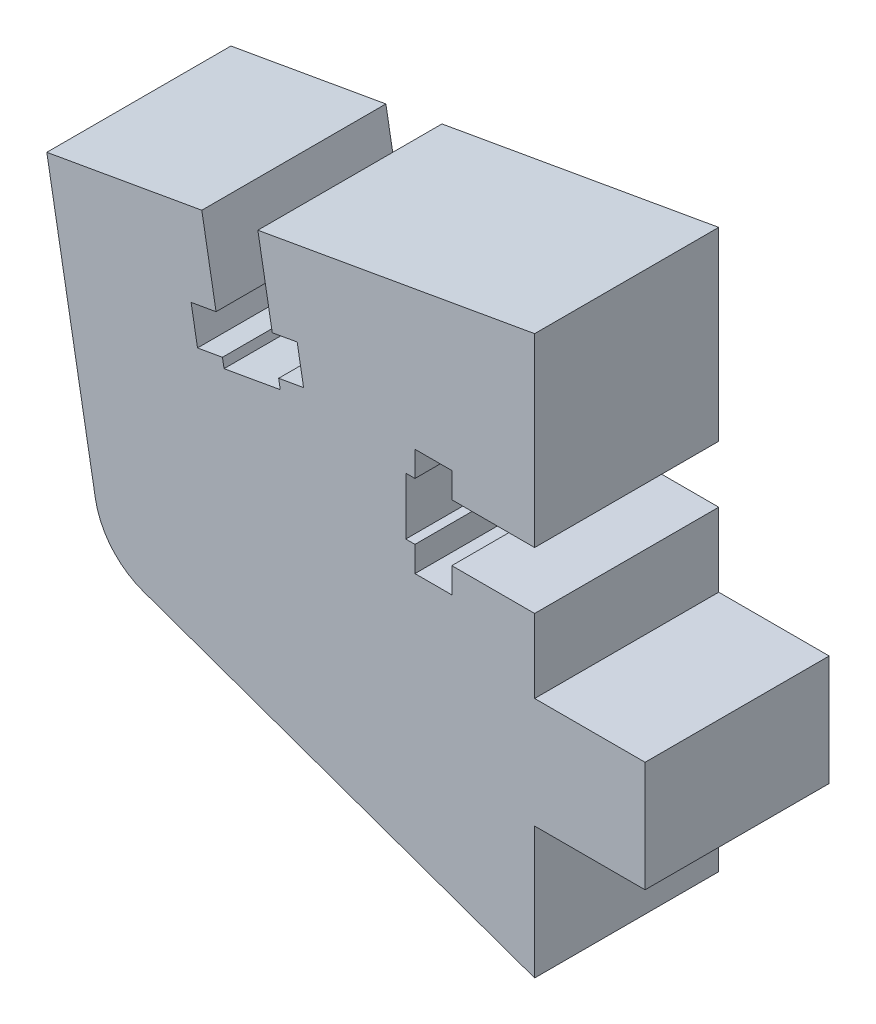
ISO-10303-21;
HEADER;
FILE_DESCRIPTION(('STEP AP214'),'2;1');
FILE_NAME('part.step','',(''),(''),'','','');
FILE_SCHEMA(('AUTOMOTIVE_DESIGN { 1 0 10303 214 1 1 1 1 }'));
ENDSEC;
DATA;
#1=APPLICATION_CONTEXT('core data for automotive mechanical design processes');
#2=APPLICATION_PROTOCOL_DEFINITION('international standard','automotive_design',2000,#1);
#3=PRODUCT_CONTEXT('',#1,'mechanical');
#4=PRODUCT('Part','Part','',(#3));
#5=PRODUCT_RELATED_PRODUCT_CATEGORY('part','',(#4));
#6=PRODUCT_DEFINITION_FORMATION('','',#4);
#7=PRODUCT_DEFINITION_CONTEXT('part definition',#1,'design');
#8=PRODUCT_DEFINITION('design','',#6,#7);
#9=PRODUCT_DEFINITION_SHAPE('','',#8);
#10=(LENGTH_UNIT() NAMED_UNIT(*) SI_UNIT(.MILLI.,.METRE.));
#11=(NAMED_UNIT(*) PLANE_ANGLE_UNIT() SI_UNIT($,.RADIAN.));
#12=(NAMED_UNIT(*) SI_UNIT($,.STERADIAN.) SOLID_ANGLE_UNIT());
#13=UNCERTAINTY_MEASURE_WITH_UNIT(LENGTH_MEASURE(1.E-05),#10,'distance_accuracy_value','');
#14=(GEOMETRIC_REPRESENTATION_CONTEXT(3) GLOBAL_UNCERTAINTY_ASSIGNED_CONTEXT((#13)) GLOBAL_UNIT_ASSIGNED_CONTEXT((#10,
#11,#12)) REPRESENTATION_CONTEXT('',''));
#15=CARTESIAN_POINT('',(0.,0.,0.));
#16=DIRECTION('',(0.,0.,1.));
#17=DIRECTION('',(1.,0.,0.));
#18=AXIS2_PLACEMENT_3D('',#15,#16,#17);
#19=CARTESIAN_POINT('',(295.514699013112,-415.313881278843,10.));
#20=DIRECTION('',(-1.,0.,0.));
#21=DIRECTION('',(0.,0.,1.));
#22=AXIS2_PLACEMENT_3D('',#19,#20,#21);
#23=PLANE('',#22);
#24=DIRECTION('',(0.,1.,0.));
#25=VECTOR('',#24,1.);
#26=CARTESIAN_POINT('',(295.514699013112,-415.313881278843,0.));
#27=LINE('',#26,#25);
#28=CARTESIAN_POINT('',(295.514699013112,-419.313881278843,0.));
#29=VERTEX_POINT('',#28);
#30=CARTESIAN_POINT('',(295.514699013112,-415.313881278843,0.));
#31=VERTEX_POINT('',#30);
#32=EDGE_CURVE('E280',#29,#31,#27,.T.);
#33=ORIENTED_EDGE('',*,*,#32,.T.);
#34=DIRECTION('',(0.,0.,-1.));
#35=VECTOR('',#34,1.);
#36=CARTESIAN_POINT('',(295.514699013112,-415.313881278843,10.));
#37=LINE('',#36,#35);
#38=CARTESIAN_POINT('',(295.514699013112,-415.313881278843,10.));
#39=VERTEX_POINT('',#38);
#40=EDGE_CURVE('E11',#39,#31,#37,.T.);
#41=ORIENTED_EDGE('',*,*,#40,.F.);
#42=DIRECTION('',(0.,1.,0.));
#43=VECTOR('',#42,1.);
#44=CARTESIAN_POINT('',(295.514699013112,-415.313881278843,10.));
#45=LINE('',#44,#43);
#46=CARTESIAN_POINT('',(295.514699013112,-419.313881278843,10.));
#47=VERTEX_POINT('',#46);
#48=EDGE_CURVE('E344',#47,#39,#45,.T.);
#49=ORIENTED_EDGE('',*,*,#48,.F.);
#50=DIRECTION('',(0.,0.,-1.));
#51=VECTOR('',#50,1.);
#52=CARTESIAN_POINT('',(295.514699013112,-419.313881278843,10.));
#53=LINE('',#52,#51);
#54=EDGE_CURVE('E276',#47,#29,#53,.T.);
#55=ORIENTED_EDGE('',*,*,#54,.T.);
#56=EDGE_LOOP('',(#33,#41,#49,#55));
#57=FACE_BOUND('',#56,.T.);
#58=ADVANCED_FACE('F34',(#57),#23,.F.);
#59=CARTESIAN_POINT('',(295.514699013112,-415.313881278843,10.));
#60=DIRECTION('',(0.,-1.,0.));
#61=DIRECTION('',(0.,0.,-1.));
#62=AXIS2_PLACEMENT_3D('',#59,#60,#61);
#63=PLANE('',#62);
#64=DIRECTION('',(-1.,0.,0.));
#65=VECTOR('',#64,1.);
#66=CARTESIAN_POINT('',(295.514699013112,-415.313881278843,0.));
#67=LINE('',#66,#65);
#68=CARTESIAN_POINT('',(291.014699013112,-415.313881278843,0.));
#69=VERTEX_POINT('',#68);
#70=EDGE_CURVE('E283',#31,#69,#67,.T.);
#71=ORIENTED_EDGE('',*,*,#70,.T.);
#72=DIRECTION('',(0.,0.,-1.));
#73=VECTOR('',#72,1.);
#74=CARTESIAN_POINT('',(291.014699013112,-415.313881278843,10.));
#75=LINE('',#74,#73);
#76=CARTESIAN_POINT('',(291.014699013112,-415.313881278843,10.));
#77=VERTEX_POINT('',#76);
#78=EDGE_CURVE('E42',#77,#69,#75,.T.);
#79=ORIENTED_EDGE('',*,*,#78,.F.);
#80=DIRECTION('',(-1.,0.,0.));
#81=VECTOR('',#80,1.);
#82=CARTESIAN_POINT('',(295.514699013112,-415.313881278843,10.));
#83=LINE('',#82,#81);
#84=EDGE_CURVE('E168',#39,#77,#83,.T.);
#85=ORIENTED_EDGE('',*,*,#84,.F.);
#86=ORIENTED_EDGE('',*,*,#40,.T.);
#87=EDGE_LOOP('',(#71,#79,#85,#86));
#88=FACE_BOUND('',#87,.T.);
#89=ADVANCED_FACE('F527',(#88),#63,.F.);
#90=CARTESIAN_POINT('',(291.014699013112,-415.313881278843,10.));
#91=DIRECTION('',(1.,0.,0.));
#92=DIRECTION('',(0.,0.,-1.));
#93=AXIS2_PLACEMENT_3D('',#90,#91,#92);
#94=PLANE('',#93);
#95=DIRECTION('',(0.,-1.,0.));
#96=VECTOR('',#95,1.);
#97=CARTESIAN_POINT('',(291.014699013112,-415.313881278843,0.));
#98=LINE('',#97,#96);
#99=CARTESIAN_POINT('',(291.014699013112,-416.688881278843,0.));
#100=VERTEX_POINT('',#99);
#101=EDGE_CURVE('E285',#69,#100,#98,.T.);
#102=ORIENTED_EDGE('',*,*,#101,.T.);
#103=DIRECTION('',(0.,0.,-1.));
#104=VECTOR('',#103,1.);
#105=CARTESIAN_POINT('',(291.014699013112,-416.688881278843,10.));
#106=LINE('',#105,#104);
#107=CARTESIAN_POINT('',(291.014699013112,-416.688881278843,10.));
#108=VERTEX_POINT('',#107);
#109=EDGE_CURVE('E426',#108,#100,#106,.T.);
#110=ORIENTED_EDGE('',*,*,#109,.F.);
#111=DIRECTION('',(0.,-1.,0.));
#112=VECTOR('',#111,1.);
#113=CARTESIAN_POINT('',(291.014699013112,-415.313881278843,10.));
#114=LINE('',#113,#112);
#115=EDGE_CURVE('E434',#77,#108,#114,.T.);
#116=ORIENTED_EDGE('',*,*,#115,.F.);
#117=ORIENTED_EDGE('',*,*,#78,.T.);
#118=EDGE_LOOP('',(#102,#110,#116,#117));
#119=FACE_BOUND('',#118,.T.);
#120=ADVANCED_FACE('F432',(#119),#94,.F.);
#121=CARTESIAN_POINT('',(289.014699013112,-416.688881278843,10.));
#122=DIRECTION('',(0.,-1.,0.));
#123=DIRECTION('',(0.,0.,-1.));
#124=AXIS2_PLACEMENT_3D('',#121,#122,#123);
#125=PLANE('',#124);
#126=DIRECTION('',(-1.,0.,0.));
#127=VECTOR('',#126,1.);
#128=CARTESIAN_POINT('',(289.014699013112,-416.688881278843,0.));
#129=LINE('',#128,#127);
#130=CARTESIAN_POINT('',(289.014699013112,-416.688881278843,0.));
#131=VERTEX_POINT('',#130);
#132=EDGE_CURVE('E287',#100,#131,#129,.T.);
#133=ORIENTED_EDGE('',*,*,#132,.T.);
#134=DIRECTION('',(0.,0.,-1.));
#135=VECTOR('',#134,1.);
#136=CARTESIAN_POINT('',(289.014699013112,-416.688881278843,10.));
#137=LINE('',#136,#135);
#138=CARTESIAN_POINT('',(289.014699013112,-416.688881278843,10.));
#139=VERTEX_POINT('',#138);
#140=EDGE_CURVE('E423',#139,#131,#137,.T.);
#141=ORIENTED_EDGE('',*,*,#140,.F.);
#142=DIRECTION('',(-1.,0.,0.));
#143=VECTOR('',#142,1.);
#144=CARTESIAN_POINT('',(289.014699013112,-416.688881278843,10.));
#145=LINE('',#144,#143);
#146=EDGE_CURVE('E452',#108,#139,#145,.T.);
#147=ORIENTED_EDGE('',*,*,#146,.F.);
#148=ORIENTED_EDGE('',*,*,#109,.T.);
#149=EDGE_LOOP('',(#133,#141,#147,#148));
#150=FACE_BOUND('',#149,.T.);
#151=ADVANCED_FACE('F443',(#150),#125,.F.);
#152=CARTESIAN_POINT('',(289.014699013112,-415.313881278843,10.));
#153=DIRECTION('',(-1.,0.,0.));
#154=DIRECTION('',(0.,0.,1.));
#155=AXIS2_PLACEMENT_3D('',#152,#153,#154);
#156=PLANE('',#155);
#157=DIRECTION('',(0.,1.,0.));
#158=VECTOR('',#157,1.);
#159=CARTESIAN_POINT('',(289.014699013112,-415.313881278843,0.));
#160=LINE('',#159,#158);
#161=CARTESIAN_POINT('',(289.014699013112,-415.313881278843,0.));
#162=VERTEX_POINT('',#161);
#163=EDGE_CURVE('E289',#131,#162,#160,.T.);
#164=ORIENTED_EDGE('',*,*,#163,.T.);
#165=DIRECTION('',(0.,0.,-1.));
#166=VECTOR('',#165,1.);
#167=CARTESIAN_POINT('',(289.014699013112,-415.313881278843,10.));
#168=LINE('',#167,#166);
#169=CARTESIAN_POINT('',(289.014699013112,-415.313881278843,10.));
#170=VERTEX_POINT('',#169);
#171=EDGE_CURVE('E420',#170,#162,#168,.T.);
#172=ORIENTED_EDGE('',*,*,#171,.F.);
#173=DIRECTION('',(0.,1.,0.));
#174=VECTOR('',#173,1.);
#175=CARTESIAN_POINT('',(289.014699013112,-415.313881278843,10.));
#176=LINE('',#175,#174);
#177=EDGE_CURVE('E449',#139,#170,#176,.T.);
#178=ORIENTED_EDGE('',*,*,#177,.F.);
#179=ORIENTED_EDGE('',*,*,#140,.T.);
#180=EDGE_LOOP('',(#164,#172,#178,#179));
#181=FACE_BOUND('',#180,.T.);
#182=ADVANCED_FACE('F447',(#181),#156,.F.);
#183=CARTESIAN_POINT('',(289.014699013112,-415.313881278843,10.));
#184=DIRECTION('',(0.,-1.,0.));
#185=DIRECTION('',(0.,0.,-1.));
#186=AXIS2_PLACEMENT_3D('',#183,#184,#185);
#187=PLANE('',#186);
#188=DIRECTION('',(-1.,0.,0.));
#189=VECTOR('',#188,1.);
#190=CARTESIAN_POINT('',(289.014699013112,-415.313881278843,0.));
#191=LINE('',#190,#189);
#192=CARTESIAN_POINT('',(288.514699013112,-415.313881278843,0.));
#193=VERTEX_POINT('',#192);
#194=EDGE_CURVE('E291',#162,#193,#191,.T.);
#195=ORIENTED_EDGE('',*,*,#194,.T.);
#196=DIRECTION('',(0.,0.,-1.));
#197=VECTOR('',#196,1.);
#198=CARTESIAN_POINT('',(288.514699013112,-415.313881278843,10.));
#199=LINE('',#198,#197);
#200=CARTESIAN_POINT('',(288.514699013112,-415.313881278843,10.));
#201=VERTEX_POINT('',#200);
#202=EDGE_CURVE('E417',#201,#193,#199,.T.);
#203=ORIENTED_EDGE('',*,*,#202,.F.);
#204=DIRECTION('',(-1.,0.,0.));
#205=VECTOR('',#204,1.);
#206=CARTESIAN_POINT('',(289.014699013112,-415.313881278843,10.));
#207=LINE('',#206,#205);
#208=EDGE_CURVE('E451',#170,#201,#207,.T.);
#209=ORIENTED_EDGE('',*,*,#208,.F.);
#210=ORIENTED_EDGE('',*,*,#171,.T.);
#211=EDGE_LOOP('',(#195,#203,#209,#210));
#212=FACE_BOUND('',#211,.T.);
#213=ADVANCED_FACE('F540',(#212),#187,.F.);
#214=CARTESIAN_POINT('',(288.514699013112,-412.213881278843,10.));
#215=DIRECTION('',(-1.,0.,0.));
#216=DIRECTION('',(0.,0.,1.));
#217=AXIS2_PLACEMENT_3D('',#214,#215,#216);
#218=PLANE('',#217);
#219=DIRECTION('',(0.,1.,0.));
#220=VECTOR('',#219,1.);
#221=CARTESIAN_POINT('',(288.514699013112,-412.213881278843,0.));
#222=LINE('',#221,#220);
#223=CARTESIAN_POINT('',(288.514699013112,-412.213881278843,0.));
#224=VERTEX_POINT('',#223);
#225=EDGE_CURVE('E293',#193,#224,#222,.T.);
#226=ORIENTED_EDGE('',*,*,#225,.T.);
#227=DIRECTION('',(0.,0.,-1.));
#228=VECTOR('',#227,1.);
#229=CARTESIAN_POINT('',(288.514699013112,-412.213881278843,10.));
#230=LINE('',#229,#228);
#231=CARTESIAN_POINT('',(288.514699013112,-412.213881278843,10.));
#232=VERTEX_POINT('',#231);
#233=EDGE_CURVE('E414',#232,#224,#230,.T.);
#234=ORIENTED_EDGE('',*,*,#233,.F.);
#235=DIRECTION('',(0.,1.,0.));
#236=VECTOR('',#235,1.);
#237=CARTESIAN_POINT('',(288.514699013112,-412.213881278843,10.));
#238=LINE('',#237,#236);
#239=EDGE_CURVE('E454',#201,#232,#238,.T.);
#240=ORIENTED_EDGE('',*,*,#239,.F.);
#241=ORIENTED_EDGE('',*,*,#202,.T.);
#242=EDGE_LOOP('',(#226,#234,#240,#241));
#243=FACE_BOUND('',#242,.T.);
#244=ADVANCED_FACE('F543',(#243),#218,.F.);
#245=CARTESIAN_POINT('',(289.014699013112,-412.213881278843,10.));
#246=DIRECTION('',(0.,1.,0.));
#247=DIRECTION('',(0.,0.,1.));
#248=AXIS2_PLACEMENT_3D('',#245,#246,#247);
#249=PLANE('',#248);
#250=DIRECTION('',(1.,0.,0.));
#251=VECTOR('',#250,1.);
#252=CARTESIAN_POINT('',(289.014699013112,-412.213881278843,0.));
#253=LINE('',#252,#251);
#254=CARTESIAN_POINT('',(289.014699013112,-412.213881278843,0.));
#255=VERTEX_POINT('',#254);
#256=EDGE_CURVE('E295',#224,#255,#253,.T.);
#257=ORIENTED_EDGE('',*,*,#256,.T.);
#258=DIRECTION('',(0.,0.,-1.));
#259=VECTOR('',#258,1.);
#260=CARTESIAN_POINT('',(289.014699013112,-412.213881278843,10.));
#261=LINE('',#260,#259);
#262=CARTESIAN_POINT('',(289.014699013112,-412.213881278843,10.));
#263=VERTEX_POINT('',#262);
#264=EDGE_CURVE('E411',#263,#255,#261,.T.);
#265=ORIENTED_EDGE('',*,*,#264,.F.);
#266=DIRECTION('',(1.,0.,0.));
#267=VECTOR('',#266,1.);
#268=CARTESIAN_POINT('',(289.014699013112,-412.213881278843,10.));
#269=LINE('',#268,#267);
#270=EDGE_CURVE('E460',#232,#263,#269,.T.);
#271=ORIENTED_EDGE('',*,*,#270,.F.);
#272=ORIENTED_EDGE('',*,*,#233,.T.);
#273=EDGE_LOOP('',(#257,#265,#271,#272));
#274=FACE_BOUND('',#273,.T.);
#275=ADVANCED_FACE('F547',(#274),#249,.F.);
#276=CARTESIAN_POINT('',(289.014699013112,-410.838881278843,10.));
#277=DIRECTION('',(-1.,0.,0.));
#278=DIRECTION('',(0.,0.,1.));
#279=AXIS2_PLACEMENT_3D('',#276,#277,#278);
#280=PLANE('',#279);
#281=DIRECTION('',(0.,1.,0.));
#282=VECTOR('',#281,1.);
#283=CARTESIAN_POINT('',(289.014699013112,-410.838881278843,0.));
#284=LINE('',#283,#282);
#285=CARTESIAN_POINT('',(289.014699013112,-410.838881278843,0.));
#286=VERTEX_POINT('',#285);
#287=EDGE_CURVE('E297',#255,#286,#284,.T.);
#288=ORIENTED_EDGE('',*,*,#287,.T.);
#289=DIRECTION('',(0.,0.,-1.));
#290=VECTOR('',#289,1.);
#291=CARTESIAN_POINT('',(289.014699013112,-410.838881278843,10.));
#292=LINE('',#291,#290);
#293=CARTESIAN_POINT('',(289.014699013112,-410.838881278843,10.));
#294=VERTEX_POINT('',#293);
#295=EDGE_CURVE('E408',#294,#286,#292,.T.);
#296=ORIENTED_EDGE('',*,*,#295,.F.);
#297=DIRECTION('',(0.,1.,0.));
#298=VECTOR('',#297,1.);
#299=CARTESIAN_POINT('',(289.014699013112,-410.838881278843,10.));
#300=LINE('',#299,#298);
#301=EDGE_CURVE('E462',#263,#294,#300,.T.);
#302=ORIENTED_EDGE('',*,*,#301,.F.);
#303=ORIENTED_EDGE('',*,*,#264,.T.);
#304=EDGE_LOOP('',(#288,#296,#302,#303));
#305=FACE_BOUND('',#304,.T.);
#306=ADVANCED_FACE('F551',(#305),#280,.F.);
#307=CARTESIAN_POINT('',(289.014699013112,-410.838881278843,10.));
#308=DIRECTION('',(0.,1.,0.));
#309=DIRECTION('',(0.,0.,1.));
#310=AXIS2_PLACEMENT_3D('',#307,#308,#309);
#311=PLANE('',#310);
#312=DIRECTION('',(1.,0.,0.));
#313=VECTOR('',#312,1.);
#314=CARTESIAN_POINT('',(289.014699013112,-410.838881278843,0.));
#315=LINE('',#314,#313);
#316=CARTESIAN_POINT('',(291.014699013112,-410.838881278843,0.));
#317=VERTEX_POINT('',#316);
#318=EDGE_CURVE('E299',#286,#317,#315,.T.);
#319=ORIENTED_EDGE('',*,*,#318,.T.);
#320=DIRECTION('',(0.,0.,-1.));
#321=VECTOR('',#320,1.);
#322=CARTESIAN_POINT('',(291.014699013112,-410.838881278843,10.));
#323=LINE('',#322,#321);
#324=CARTESIAN_POINT('',(291.014699013112,-410.838881278843,10.));
#325=VERTEX_POINT('',#324);
#326=EDGE_CURVE('E405',#325,#317,#323,.T.);
#327=ORIENTED_EDGE('',*,*,#326,.F.);
#328=DIRECTION('',(1.,0.,0.));
#329=VECTOR('',#328,1.);
#330=CARTESIAN_POINT('',(289.014699013112,-410.838881278843,10.));
#331=LINE('',#330,#329);
#332=EDGE_CURVE('E464',#294,#325,#331,.T.);
#333=ORIENTED_EDGE('',*,*,#332,.F.);
#334=ORIENTED_EDGE('',*,*,#295,.T.);
#335=EDGE_LOOP('',(#319,#327,#333,#334));
#336=FACE_BOUND('',#335,.T.);
#337=ADVANCED_FACE('F555',(#336),#311,.F.);
#338=CARTESIAN_POINT('',(291.014699013112,-410.838881278843,10.));
#339=DIRECTION('',(1.,0.,0.));
#340=DIRECTION('',(0.,0.,-1.));
#341=AXIS2_PLACEMENT_3D('',#338,#339,#340);
#342=PLANE('',#341);
#343=DIRECTION('',(0.,-1.,0.));
#344=VECTOR('',#343,1.);
#345=CARTESIAN_POINT('',(291.014699013112,-410.838881278843,0.));
#346=LINE('',#345,#344);
#347=CARTESIAN_POINT('',(291.014699013112,-412.213881278843,0.));
#348=VERTEX_POINT('',#347);
#349=EDGE_CURVE('E301',#317,#348,#346,.T.);
#350=ORIENTED_EDGE('',*,*,#349,.T.);
#351=DIRECTION('',(0.,0.,-1.));
#352=VECTOR('',#351,1.);
#353=CARTESIAN_POINT('',(291.014699013112,-412.213881278843,10.));
#354=LINE('',#353,#352);
#355=CARTESIAN_POINT('',(291.014699013112,-412.213881278843,10.));
#356=VERTEX_POINT('',#355);
#357=EDGE_CURVE('E402',#356,#348,#354,.T.);
#358=ORIENTED_EDGE('',*,*,#357,.F.);
#359=DIRECTION('',(0.,-1.,0.));
#360=VECTOR('',#359,1.);
#361=CARTESIAN_POINT('',(291.014699013112,-410.838881278843,10.));
#362=LINE('',#361,#360);
#363=EDGE_CURVE('E466',#325,#356,#362,.T.);
#364=ORIENTED_EDGE('',*,*,#363,.F.);
#365=ORIENTED_EDGE('',*,*,#326,.T.);
#366=EDGE_LOOP('',(#350,#358,#364,#365));
#367=FACE_BOUND('',#366,.T.);
#368=ADVANCED_FACE('F559',(#367),#342,.F.);
#369=CARTESIAN_POINT('',(295.514699013112,-412.213881278843,10.));
#370=DIRECTION('',(0.,1.,0.));
#371=DIRECTION('',(0.,0.,1.));
#372=AXIS2_PLACEMENT_3D('',#369,#370,#371);
#373=PLANE('',#372);
#374=DIRECTION('',(1.,0.,0.));
#375=VECTOR('',#374,1.);
#376=CARTESIAN_POINT('',(295.514699013112,-412.213881278843,0.));
#377=LINE('',#376,#375);
#378=CARTESIAN_POINT('',(295.514699013112,-412.213881278843,0.));
#379=VERTEX_POINT('',#378);
#380=EDGE_CURVE('E303',#348,#379,#377,.T.);
#381=ORIENTED_EDGE('',*,*,#380,.T.);
#382=DIRECTION('',(0.,0.,-1.));
#383=VECTOR('',#382,1.);
#384=CARTESIAN_POINT('',(295.514699013112,-412.213881278843,10.));
#385=LINE('',#384,#383);
#386=CARTESIAN_POINT('',(295.514699013112,-412.213881278843,10.));
#387=VERTEX_POINT('',#386);
#388=EDGE_CURVE('E399',#387,#379,#385,.T.);
#389=ORIENTED_EDGE('',*,*,#388,.F.);
#390=DIRECTION('',(1.,0.,0.));
#391=VECTOR('',#390,1.);
#392=CARTESIAN_POINT('',(295.514699013112,-412.213881278843,10.));
#393=LINE('',#392,#391);
#394=EDGE_CURVE('E468',#356,#387,#393,.T.);
#395=ORIENTED_EDGE('',*,*,#394,.F.);
#396=ORIENTED_EDGE('',*,*,#357,.T.);
#397=EDGE_LOOP('',(#381,#389,#395,#396));
#398=FACE_BOUND('',#397,.T.);
#399=ADVANCED_FACE('F563',(#398),#373,.F.);
#400=CARTESIAN_POINT('',(295.514699013112,-402.150585233422,10.));
#401=DIRECTION('',(-1.,0.,0.));
#402=DIRECTION('',(0.,0.,1.));
#403=AXIS2_PLACEMENT_3D('',#400,#401,#402);
#404=PLANE('',#403);
#405=DIRECTION('',(0.,1.,0.));
#406=VECTOR('',#405,1.);
#407=CARTESIAN_POINT('',(295.514699013112,-402.150585233422,0.));
#408=LINE('',#407,#406);
#409=CARTESIAN_POINT('',(295.514699013112,-402.150585233422,0.));
#410=VERTEX_POINT('',#409);
#411=EDGE_CURVE('E305',#379,#410,#408,.T.);
#412=ORIENTED_EDGE('',*,*,#411,.T.);
#413=DIRECTION('',(0.,0.,-1.));
#414=VECTOR('',#413,1.);
#415=CARTESIAN_POINT('',(295.514699013112,-402.150585233422,10.));
#416=LINE('',#415,#414);
#417=CARTESIAN_POINT('',(295.514699013112,-402.150585233422,10.));
#418=VERTEX_POINT('',#417);
#419=EDGE_CURVE('E396',#418,#410,#416,.T.);
#420=ORIENTED_EDGE('',*,*,#419,.F.);
#421=DIRECTION('',(0.,1.,0.));
#422=VECTOR('',#421,1.);
#423=CARTESIAN_POINT('',(295.514699013112,-402.150585233422,10.));
#424=LINE('',#423,#422);
#425=EDGE_CURVE('E470',#387,#418,#424,.T.);
#426=ORIENTED_EDGE('',*,*,#425,.F.);
#427=ORIENTED_EDGE('',*,*,#388,.T.);
#428=EDGE_LOOP('',(#412,#420,#426,#427));
#429=FACE_BOUND('',#428,.T.);
#430=ADVANCED_FACE('F567',(#429),#404,.F.);
#431=CARTESIAN_POINT('',(280.480655480191,-404.801492737414,10.));
#432=DIRECTION('',(0.173648177666408,-0.9848077530123,0.));
#433=DIRECTION('',(0.9848077530123,0.173648177666408,0.));
#434=AXIS2_PLACEMENT_3D('',#431,#432,#433);
#435=PLANE('',#434);
#436=DIRECTION('',(-0.9848077530123,-0.173648177666408,0.));
#437=VECTOR('',#436,1.);
#438=CARTESIAN_POINT('',(280.480655480191,-404.801492737414,0.));
#439=LINE('',#438,#437);
#440=CARTESIAN_POINT('',(280.480655480191,-404.801492737414,0.));
#441=VERTEX_POINT('',#440);
#442=EDGE_CURVE('E307',#410,#441,#439,.T.);
#443=ORIENTED_EDGE('',*,*,#442,.T.);
#444=DIRECTION('',(0.,0.,-1.));
#445=VECTOR('',#444,1.);
#446=CARTESIAN_POINT('',(280.480655480191,-404.801492737414,10.));
#447=LINE('',#446,#445);
#448=CARTESIAN_POINT('',(280.480655480191,-404.801492737414,10.));
#449=VERTEX_POINT('',#448);
#450=EDGE_CURVE('E393',#449,#441,#447,.T.);
#451=ORIENTED_EDGE('',*,*,#450,.F.);
#452=DIRECTION('',(-0.9848077530123,-0.173648177666408,0.));
#453=VECTOR('',#452,1.);
#454=CARTESIAN_POINT('',(280.480655480191,-404.801492737414,10.));
#455=LINE('',#454,#453);
#456=EDGE_CURVE('E472',#418,#449,#455,.T.);
#457=ORIENTED_EDGE('',*,*,#456,.F.);
#458=ORIENTED_EDGE('',*,*,#419,.T.);
#459=EDGE_LOOP('',(#443,#451,#457,#458));
#460=FACE_BOUND('',#459,.T.);
#461=ADVANCED_FACE('F571',(#460),#435,.F.);
#462=CARTESIAN_POINT('',(280.480655480191,-404.801492737414,10.));
#463=DIRECTION('',(0.9848077530123,0.173648177666408,0.));
#464=DIRECTION('',(-0.173648177666408,0.9848077530123,0.));
#465=AXIS2_PLACEMENT_3D('',#462,#463,#464);
#466=PLANE('',#465);
#467=DIRECTION('',(0.173648177666408,-0.9848077530123,0.));
#468=VECTOR('',#467,1.);
#469=CARTESIAN_POINT('',(280.480655480191,-404.801492737414,0.));
#470=LINE('',#469,#468);
#471=CARTESIAN_POINT('',(281.26207227969,-409.233127625969,0.));
#472=VERTEX_POINT('',#471);
#473=EDGE_CURVE('E309',#441,#472,#470,.T.);
#474=ORIENTED_EDGE('',*,*,#473,.T.);
#475=DIRECTION('',(0.,0.,-1.));
#476=VECTOR('',#475,1.);
#477=CARTESIAN_POINT('',(281.26207227969,-409.233127625969,10.));
#478=LINE('',#477,#476);
#479=CARTESIAN_POINT('',(281.26207227969,-409.233127625969,10.));
#480=VERTEX_POINT('',#479);
#481=EDGE_CURVE('E390',#480,#472,#478,.T.);
#482=ORIENTED_EDGE('',*,*,#481,.F.);
#483=DIRECTION('',(0.173648177666408,-0.9848077530123,0.));
#484=VECTOR('',#483,1.);
#485=CARTESIAN_POINT('',(280.480655480191,-404.801492737414,10.));
#486=LINE('',#485,#484);
#487=EDGE_CURVE('E474',#449,#480,#486,.T.);
#488=ORIENTED_EDGE('',*,*,#487,.F.);
#489=ORIENTED_EDGE('',*,*,#450,.T.);
#490=EDGE_LOOP('',(#474,#482,#488,#489));
#491=FACE_BOUND('',#490,.T.);
#492=ADVANCED_FACE('F575',(#491),#466,.F.);
#493=CARTESIAN_POINT('',(281.26207227969,-409.233127625969,10.));
#494=DIRECTION('',(-0.173648177666406,0.984807753012301,0.));
#495=DIRECTION('',(-0.984807753012301,-0.173648177666406,0.));
#496=AXIS2_PLACEMENT_3D('',#493,#494,#495);
#497=PLANE('',#496);
#498=DIRECTION('',(0.984807753012301,0.173648177666406,0.));
#499=VECTOR('',#498,1.);
#500=CARTESIAN_POINT('',(281.26207227969,-409.233127625969,0.));
#501=LINE('',#500,#499);
#502=CARTESIAN_POINT('',(282.616182940082,-408.994361381678,0.));
#503=VERTEX_POINT('',#502);
#504=EDGE_CURVE('E311',#472,#503,#501,.T.);
#505=ORIENTED_EDGE('',*,*,#504,.T.);
#506=DIRECTION('',(0.,0.,-1.));
#507=VECTOR('',#506,1.);
#508=CARTESIAN_POINT('',(282.616182940082,-408.994361381678,10.));
#509=LINE('',#508,#507);
#510=CARTESIAN_POINT('',(282.616182940082,-408.994361381678,10.));
#511=VERTEX_POINT('',#510);
#512=EDGE_CURVE('E387',#511,#503,#509,.T.);
#513=ORIENTED_EDGE('',*,*,#512,.F.);
#514=DIRECTION('',(0.984807753012301,0.173648177666406,0.));
#515=VECTOR('',#514,1.);
#516=CARTESIAN_POINT('',(281.26207227969,-409.233127625969,10.));
#517=LINE('',#516,#515);
#518=EDGE_CURVE('E476',#480,#511,#517,.T.);
#519=ORIENTED_EDGE('',*,*,#518,.F.);
#520=ORIENTED_EDGE('',*,*,#481,.T.);
#521=EDGE_LOOP('',(#505,#513,#519,#520));
#522=FACE_BOUND('',#521,.T.);
#523=ADVANCED_FACE('F579',(#522),#497,.F.);
#524=CARTESIAN_POINT('',(282.616182940082,-408.994361381678,10.));
#525=DIRECTION('',(0.9848077530123,0.173648177666409,0.));
#526=DIRECTION('',(-0.173648177666409,0.9848077530123,0.));
#527=AXIS2_PLACEMENT_3D('',#524,#525,#526);
#528=PLANE('',#527);
#529=DIRECTION('',(0.173648177666409,-0.9848077530123,0.));
#530=VECTOR('',#529,1.);
#531=CARTESIAN_POINT('',(282.616182940082,-408.994361381678,0.));
#532=LINE('',#531,#530);
#533=CARTESIAN_POINT('',(282.963479295415,-410.963976887702,0.));
#534=VERTEX_POINT('',#533);
#535=EDGE_CURVE('E313',#503,#534,#532,.T.);
#536=ORIENTED_EDGE('',*,*,#535,.T.);
#537=DIRECTION('',(0.,0.,-1.));
#538=VECTOR('',#537,1.);
#539=CARTESIAN_POINT('',(282.963479295415,-410.963976887702,10.));
#540=LINE('',#539,#538);
#541=CARTESIAN_POINT('',(282.963479295415,-410.963976887702,10.));
#542=VERTEX_POINT('',#541);
#543=EDGE_CURVE('E384',#542,#534,#540,.T.);
#544=ORIENTED_EDGE('',*,*,#543,.F.);
#545=DIRECTION('',(0.173648177666409,-0.9848077530123,0.));
#546=VECTOR('',#545,1.);
#547=CARTESIAN_POINT('',(282.616182940082,-408.994361381678,10.));
#548=LINE('',#547,#546);
#549=EDGE_CURVE('E478',#511,#542,#548,.T.);
#550=ORIENTED_EDGE('',*,*,#549,.F.);
#551=ORIENTED_EDGE('',*,*,#512,.T.);
#552=EDGE_LOOP('',(#536,#544,#550,#551));
#553=FACE_BOUND('',#552,.T.);
#554=ADVANCED_FACE('F583',(#553),#528,.F.);
#555=CARTESIAN_POINT('',(281.609368635023,-411.202743131994,10.));
#556=DIRECTION('',(0.173648177666406,-0.984807753012301,0.));
#557=DIRECTION('',(0.984807753012301,0.173648177666406,0.));
#558=AXIS2_PLACEMENT_3D('',#555,#556,#557);
#559=PLANE('',#558);
#560=DIRECTION('',(-0.984807753012301,-0.173648177666406,0.));
#561=VECTOR('',#560,1.);
#562=CARTESIAN_POINT('',(281.609368635023,-411.202743131994,0.));
#563=LINE('',#562,#561);
#564=CARTESIAN_POINT('',(281.609368635023,-411.202743131994,0.));
#565=VERTEX_POINT('',#564);
#566=EDGE_CURVE('E315',#534,#565,#563,.T.);
#567=ORIENTED_EDGE('',*,*,#566,.T.);
#568=DIRECTION('',(0.,0.,-1.));
#569=VECTOR('',#568,1.);
#570=CARTESIAN_POINT('',(281.609368635023,-411.202743131994,10.));
#571=LINE('',#570,#569);
#572=CARTESIAN_POINT('',(281.609368635023,-411.202743131994,10.));
#573=VERTEX_POINT('',#572);
#574=EDGE_CURVE('E381',#573,#565,#571,.T.);
#575=ORIENTED_EDGE('',*,*,#574,.F.);
#576=DIRECTION('',(-0.984807753012301,-0.173648177666406,0.));
#577=VECTOR('',#576,1.);
#578=CARTESIAN_POINT('',(281.609368635023,-411.202743131994,10.));
#579=LINE('',#578,#577);
#580=EDGE_CURVE('E480',#542,#573,#579,.T.);
#581=ORIENTED_EDGE('',*,*,#580,.F.);
#582=ORIENTED_EDGE('',*,*,#543,.T.);
#583=EDGE_LOOP('',(#567,#575,#581,#582));
#584=FACE_BOUND('',#583,.T.);
#585=ADVANCED_FACE('F587',(#584),#559,.F.);
#586=CARTESIAN_POINT('',(281.609368635023,-411.202743131994,10.));
#587=DIRECTION('',(0.984807753012302,0.173648177666399,0.));
#588=DIRECTION('',(-0.173648177666399,0.984807753012302,0.));
#589=AXIS2_PLACEMENT_3D('',#586,#587,#588);
#590=PLANE('',#589);
#591=DIRECTION('',(0.173648177666399,-0.984807753012302,0.));
#592=VECTOR('',#591,1.);
#593=CARTESIAN_POINT('',(281.609368635023,-411.202743131994,0.));
#594=LINE('',#593,#592);
#595=CARTESIAN_POINT('',(281.696192723856,-411.6951470085,0.));
#596=VERTEX_POINT('',#595);
#597=EDGE_CURVE('E317',#565,#596,#594,.T.);
#598=ORIENTED_EDGE('',*,*,#597,.T.);
#599=DIRECTION('',(0.,0.,-1.));
#600=VECTOR('',#599,1.);
#601=CARTESIAN_POINT('',(281.696192723856,-411.6951470085,10.));
#602=LINE('',#601,#600);
#603=CARTESIAN_POINT('',(281.696192723856,-411.6951470085,10.));
#604=VERTEX_POINT('',#603);
#605=EDGE_CURVE('E378',#604,#596,#602,.T.);
#606=ORIENTED_EDGE('',*,*,#605,.F.);
#607=DIRECTION('',(0.173648177666399,-0.984807753012302,0.));
#608=VECTOR('',#607,1.);
#609=CARTESIAN_POINT('',(281.609368635023,-411.202743131994,10.));
#610=LINE('',#609,#608);
#611=EDGE_CURVE('E482',#573,#604,#610,.T.);
#612=ORIENTED_EDGE('',*,*,#611,.F.);
#613=ORIENTED_EDGE('',*,*,#574,.T.);
#614=EDGE_LOOP('',(#598,#606,#612,#613));
#615=FACE_BOUND('',#614,.T.);
#616=ADVANCED_FACE('F591',(#615),#590,.F.);
#617=CARTESIAN_POINT('',(278.643288689518,-412.233456359266,10.));
#618=DIRECTION('',(0.173648177666412,-0.984807753012299,0.));
#619=DIRECTION('',(0.984807753012299,0.173648177666412,0.));
#620=AXIS2_PLACEMENT_3D('',#617,#618,#619);
#621=PLANE('',#620);
#622=DIRECTION('',(-0.984807753012299,-0.173648177666412,0.));
#623=VECTOR('',#622,1.);
#624=CARTESIAN_POINT('',(278.643288689518,-412.233456359266,0.));
#625=LINE('',#624,#623);
#626=CARTESIAN_POINT('',(278.643288689518,-412.233456359266,0.));
#627=VERTEX_POINT('',#626);
#628=EDGE_CURVE('E319',#596,#627,#625,.T.);
#629=ORIENTED_EDGE('',*,*,#628,.T.);
#630=DIRECTION('',(0.,0.,-1.));
#631=VECTOR('',#630,1.);
#632=CARTESIAN_POINT('',(278.643288689518,-412.233456359266,10.));
#633=LINE('',#632,#631);
#634=CARTESIAN_POINT('',(278.643288689518,-412.233456359266,10.));
#635=VERTEX_POINT('',#634);
#636=EDGE_CURVE('E375',#635,#627,#633,.T.);
#637=ORIENTED_EDGE('',*,*,#636,.F.);
#638=DIRECTION('',(-0.984807753012299,-0.173648177666412,0.));
#639=VECTOR('',#638,1.);
#640=CARTESIAN_POINT('',(278.643288689518,-412.233456359266,10.));
#641=LINE('',#640,#639);
#642=EDGE_CURVE('E484',#604,#635,#641,.T.);
#643=ORIENTED_EDGE('',*,*,#642,.F.);
#644=ORIENTED_EDGE('',*,*,#605,.T.);
#645=EDGE_LOOP('',(#629,#637,#643,#644));
#646=FACE_BOUND('',#645,.T.);
#647=ADVANCED_FACE('F595',(#646),#621,.F.);
#648=CARTESIAN_POINT('',(278.556464600685,-411.741052482759,10.));
#649=DIRECTION('',(-0.984807753012302,-0.173648177666399,0.));
#650=DIRECTION('',(0.173648177666399,-0.984807753012302,0.));
#651=AXIS2_PLACEMENT_3D('',#648,#649,#650);
#652=PLANE('',#651);
#653=DIRECTION('',(-0.173648177666399,0.984807753012302,0.));
#654=VECTOR('',#653,1.);
#655=CARTESIAN_POINT('',(278.556464600685,-411.741052482759,0.));
#656=LINE('',#655,#654);
#657=CARTESIAN_POINT('',(278.556464600685,-411.741052482759,0.));
#658=VERTEX_POINT('',#657);
#659=EDGE_CURVE('E321',#627,#658,#656,.T.);
#660=ORIENTED_EDGE('',*,*,#659,.T.);
#661=DIRECTION('',(0.,0.,-1.));
#662=VECTOR('',#661,1.);
#663=CARTESIAN_POINT('',(278.556464600685,-411.741052482759,10.));
#664=LINE('',#663,#662);
#665=CARTESIAN_POINT('',(278.556464600685,-411.741052482759,10.));
#666=VERTEX_POINT('',#665);
#667=EDGE_CURVE('E372',#666,#658,#664,.T.);
#668=ORIENTED_EDGE('',*,*,#667,.F.);
#669=DIRECTION('',(-0.173648177666399,0.984807753012302,0.));
#670=VECTOR('',#669,1.);
#671=CARTESIAN_POINT('',(278.556464600685,-411.741052482759,10.));
#672=LINE('',#671,#670);
#673=EDGE_CURVE('E486',#635,#666,#672,.T.);
#674=ORIENTED_EDGE('',*,*,#673,.F.);
#675=ORIENTED_EDGE('',*,*,#636,.T.);
#676=EDGE_LOOP('',(#660,#668,#674,#675));
#677=FACE_BOUND('',#676,.T.);
#678=ADVANCED_FACE('F599',(#677),#652,.F.);
#679=CARTESIAN_POINT('',(277.202353940293,-411.979818727051,10.));
#680=DIRECTION('',(0.173648177666406,-0.984807753012301,0.));
#681=DIRECTION('',(0.984807753012301,0.173648177666406,0.));
#682=AXIS2_PLACEMENT_3D('',#679,#680,#681);
#683=PLANE('',#682);
#684=DIRECTION('',(-0.984807753012301,-0.173648177666406,0.));
#685=VECTOR('',#684,1.);
#686=CARTESIAN_POINT('',(277.202353940293,-411.979818727051,0.));
#687=LINE('',#686,#685);
#688=CARTESIAN_POINT('',(277.202353940293,-411.979818727051,0.));
#689=VERTEX_POINT('',#688);
#690=EDGE_CURVE('E323',#658,#689,#687,.T.);
#691=ORIENTED_EDGE('',*,*,#690,.T.);
#692=DIRECTION('',(0.,0.,-1.));
#693=VECTOR('',#692,1.);
#694=CARTESIAN_POINT('',(277.202353940293,-411.979818727051,10.));
#695=LINE('',#694,#693);
#696=CARTESIAN_POINT('',(277.202353940293,-411.979818727051,10.));
#697=VERTEX_POINT('',#696);
#698=EDGE_CURVE('E369',#697,#689,#695,.T.);
#699=ORIENTED_EDGE('',*,*,#698,.F.);
#700=DIRECTION('',(-0.984807753012301,-0.173648177666406,0.));
#701=VECTOR('',#700,1.);
#702=CARTESIAN_POINT('',(277.202353940293,-411.979818727051,10.));
#703=LINE('',#702,#701);
#704=EDGE_CURVE('E488',#666,#697,#703,.T.);
#705=ORIENTED_EDGE('',*,*,#704,.F.);
#706=ORIENTED_EDGE('',*,*,#667,.T.);
#707=EDGE_LOOP('',(#691,#699,#705,#706));
#708=FACE_BOUND('',#707,.T.);
#709=ADVANCED_FACE('F603',(#708),#683,.F.);
#710=CARTESIAN_POINT('',(276.85505758496,-410.010203221026,10.));
#711=DIRECTION('',(-0.9848077530123,-0.173648177666409,0.));
#712=DIRECTION('',(0.173648177666409,-0.9848077530123,0.));
#713=AXIS2_PLACEMENT_3D('',#710,#711,#712);
#714=PLANE('',#713);
#715=DIRECTION('',(-0.173648177666409,0.9848077530123,0.));
#716=VECTOR('',#715,1.);
#717=CARTESIAN_POINT('',(276.85505758496,-410.010203221026,0.));
#718=LINE('',#717,#716);
#719=CARTESIAN_POINT('',(276.85505758496,-410.010203221026,0.));
#720=VERTEX_POINT('',#719);
#721=EDGE_CURVE('E325',#689,#720,#718,.T.);
#722=ORIENTED_EDGE('',*,*,#721,.T.);
#723=DIRECTION('',(0.,0.,-1.));
#724=VECTOR('',#723,1.);
#725=CARTESIAN_POINT('',(276.85505758496,-410.010203221026,10.));
#726=LINE('',#725,#724);
#727=CARTESIAN_POINT('',(276.85505758496,-410.010203221026,10.));
#728=VERTEX_POINT('',#727);
#729=EDGE_CURVE('E366',#728,#720,#726,.T.);
#730=ORIENTED_EDGE('',*,*,#729,.F.);
#731=DIRECTION('',(-0.173648177666409,0.9848077530123,0.));
#732=VECTOR('',#731,1.);
#733=CARTESIAN_POINT('',(276.85505758496,-410.010203221026,10.));
#734=LINE('',#733,#732);
#735=EDGE_CURVE('E490',#697,#728,#734,.T.);
#736=ORIENTED_EDGE('',*,*,#735,.F.);
#737=ORIENTED_EDGE('',*,*,#698,.T.);
#738=EDGE_LOOP('',(#722,#730,#736,#737));
#739=FACE_BOUND('',#738,.T.);
#740=ADVANCED_FACE('F607',(#739),#714,.F.);
#741=CARTESIAN_POINT('',(276.85505758496,-410.010203221026,10.));
#742=DIRECTION('',(-0.173648177666406,0.984807753012301,0.));
#743=DIRECTION('',(-0.984807753012301,-0.173648177666406,0.));
#744=AXIS2_PLACEMENT_3D('',#741,#742,#743);
#745=PLANE('',#744);
#746=DIRECTION('',(0.984807753012301,0.173648177666406,0.));
#747=VECTOR('',#746,1.);
#748=CARTESIAN_POINT('',(276.85505758496,-410.010203221026,0.));
#749=LINE('',#748,#747);
#750=CARTESIAN_POINT('',(278.209168245352,-409.771436976735,0.));
#751=VERTEX_POINT('',#750);
#752=EDGE_CURVE('E327',#720,#751,#749,.T.);
#753=ORIENTED_EDGE('',*,*,#752,.T.);
#754=DIRECTION('',(0.,0.,-1.));
#755=VECTOR('',#754,1.);
#756=CARTESIAN_POINT('',(278.209168245352,-409.771436976735,10.));
#757=LINE('',#756,#755);
#758=CARTESIAN_POINT('',(278.209168245352,-409.771436976735,10.));
#759=VERTEX_POINT('',#758);
#760=EDGE_CURVE('E363',#759,#751,#757,.T.);
#761=ORIENTED_EDGE('',*,*,#760,.F.);
#762=DIRECTION('',(0.984807753012301,0.173648177666406,0.));
#763=VECTOR('',#762,1.);
#764=CARTESIAN_POINT('',(276.85505758496,-410.010203221026,10.));
#765=LINE('',#764,#763);
#766=EDGE_CURVE('E492',#728,#759,#765,.T.);
#767=ORIENTED_EDGE('',*,*,#766,.F.);
#768=ORIENTED_EDGE('',*,*,#729,.T.);
#769=EDGE_LOOP('',(#753,#761,#767,#768));
#770=FACE_BOUND('',#769,.T.);
#771=ADVANCED_FACE('F611',(#770),#745,.F.);
#772=CARTESIAN_POINT('',(277.43554798757,-405.384018473478,10.));
#773=DIRECTION('',(-0.9848077530123,-0.17364817766641,0.));
#774=DIRECTION('',(0.17364817766641,-0.9848077530123,0.));
#775=AXIS2_PLACEMENT_3D('',#772,#773,#774);
#776=PLANE('',#775);
#777=DIRECTION('',(-0.17364817766641,0.9848077530123,0.));
#778=VECTOR('',#777,1.);
#779=CARTESIAN_POINT('',(277.43554798757,-405.384018473478,0.));
#780=LINE('',#779,#778);
#781=CARTESIAN_POINT('',(277.43554798757,-405.384018473478,0.));
#782=VERTEX_POINT('',#781);
#783=EDGE_CURVE('E329',#751,#782,#780,.T.);
#784=ORIENTED_EDGE('',*,*,#783,.T.);
#785=DIRECTION('',(0.,0.,-1.));
#786=VECTOR('',#785,1.);
#787=CARTESIAN_POINT('',(277.43554798757,-405.384018473478,10.));
#788=LINE('',#787,#786);
#789=CARTESIAN_POINT('',(277.43554798757,-405.384018473478,10.));
#790=VERTEX_POINT('',#789);
#791=EDGE_CURVE('E360',#790,#782,#788,.T.);
#792=ORIENTED_EDGE('',*,*,#791,.F.);
#793=DIRECTION('',(-0.17364817766641,0.9848077530123,0.));
#794=VECTOR('',#793,1.);
#795=CARTESIAN_POINT('',(277.43554798757,-405.384018473478,10.));
#796=LINE('',#795,#794);
#797=EDGE_CURVE('E494',#759,#790,#796,.T.);
#798=ORIENTED_EDGE('',*,*,#797,.F.);
#799=ORIENTED_EDGE('',*,*,#760,.T.);
#800=EDGE_LOOP('',(#784,#792,#798,#799));
#801=FACE_BOUND('',#800,.T.);
#802=ADVANCED_FACE('F615',(#801),#776,.F.);
#803=CARTESIAN_POINT('',(269.016524323874,-406.868519496606,10.));
#804=DIRECTION('',(0.173648177666413,-0.984807753012299,0.));
#805=DIRECTION('',(0.984807753012299,0.173648177666413,0.));
#806=AXIS2_PLACEMENT_3D('',#803,#804,#805);
#807=PLANE('',#806);
#808=DIRECTION('',(-0.984807753012299,-0.173648177666413,0.));
#809=VECTOR('',#808,1.);
#810=CARTESIAN_POINT('',(269.016524323874,-406.868519496606,0.));
#811=LINE('',#810,#809);
#812=CARTESIAN_POINT('',(269.016524323874,-406.868519496606,0.));
#813=VERTEX_POINT('',#812);
#814=EDGE_CURVE('E331',#782,#813,#811,.T.);
#815=ORIENTED_EDGE('',*,*,#814,.T.);
#816=DIRECTION('',(0.,0.,-1.));
#817=VECTOR('',#816,1.);
#818=CARTESIAN_POINT('',(269.016524323874,-406.868519496606,10.));
#819=LINE('',#818,#817);
#820=CARTESIAN_POINT('',(269.016524323874,-406.868519496606,10.));
#821=VERTEX_POINT('',#820);
#822=EDGE_CURVE('E357',#821,#813,#819,.T.);
#823=ORIENTED_EDGE('',*,*,#822,.F.);
#824=DIRECTION('',(-0.984807753012299,-0.173648177666413,0.));
#825=VECTOR('',#824,1.);
#826=CARTESIAN_POINT('',(269.016524323874,-406.868519496606,10.));
#827=LINE('',#826,#825);
#828=EDGE_CURVE('E496',#790,#821,#827,.T.);
#829=ORIENTED_EDGE('',*,*,#828,.F.);
#830=ORIENTED_EDGE('',*,*,#791,.T.);
#831=EDGE_LOOP('',(#815,#823,#829,#830));
#832=FACE_BOUND('',#831,.T.);
#833=ADVANCED_FACE('F619',(#832),#807,.F.);
#834=CARTESIAN_POINT('',(269.016524323874,-406.868519496606,10.));
#835=DIRECTION('',(0.984807753012299,0.173648177666414,0.));
#836=DIRECTION('',(-0.173648177666414,0.984807753012299,0.));
#837=AXIS2_PLACEMENT_3D('',#834,#835,#836);
#838=PLANE('',#837);
#839=DIRECTION('',(0.173648177666414,-0.984807753012299,0.));
#840=VECTOR('',#839,1.);
#841=CARTESIAN_POINT('',(269.016524323874,-406.868519496606,0.));
#842=LINE('',#841,#840);
#843=CARTESIAN_POINT('',(271.654292787711,-421.82804782997,0.));
#844=VERTEX_POINT('',#843);
#845=EDGE_CURVE('E333',#813,#844,#842,.T.);
#846=ORIENTED_EDGE('',*,*,#845,.T.);
#847=DIRECTION('',(0.,0.,-1.));
#848=VECTOR('',#847,1.);
#849=CARTESIAN_POINT('',(271.654292787711,-421.82804782997,10.));
#850=LINE('',#849,#848);
#851=CARTESIAN_POINT('',(271.654292787711,-421.82804782997,10.));
#852=VERTEX_POINT('',#851);
#853=EDGE_CURVE('E354',#852,#844,#850,.T.);
#854=ORIENTED_EDGE('',*,*,#853,.F.);
#855=DIRECTION('',(0.173648177666414,-0.984807753012299,0.));
#856=VECTOR('',#855,1.);
#857=CARTESIAN_POINT('',(269.016524323874,-406.868519496606,10.));
#858=LINE('',#857,#856);
#859=EDGE_CURVE('E498',#821,#852,#858,.T.);
#860=ORIENTED_EDGE('',*,*,#859,.F.);
#861=ORIENTED_EDGE('',*,*,#822,.T.);
#862=EDGE_LOOP('',(#846,#854,#860,#861));
#863=FACE_BOUND('',#862,.T.);
#864=ADVANCED_FACE('F623',(#863),#838,.F.);
#865=CARTESIAN_POINT('',(275.59352379976,-421.133455119305,10.));
#866=DIRECTION('',(0.,0.,-1.));
#867=DIRECTION('',(-1.,0.,0.));
#868=AXIS2_PLACEMENT_3D('',#865,#866,#867);
#869=CYLINDRICAL_SURFACE('',#868,3.99999999999992);
#870=CARTESIAN_POINT('',(275.59352379976,-421.133455119305,0.));
#871=DIRECTION('',(0.,0.,1.));
#872=DIRECTION('',(-1.,0.,0.));
#873=AXIS2_PLACEMENT_3D('',#870,#871,#872);
#874=CIRCLE('',#873,3.99999999999992);
#875=CARTESIAN_POINT('',(274.253329280596,-424.902258463976,0.));
#876=VERTEX_POINT('',#875);
#877=EDGE_CURVE('E335',#844,#876,#874,.T.);
#878=ORIENTED_EDGE('',*,*,#877,.T.);
#879=DIRECTION('',(0.,0.,-1.));
#880=VECTOR('',#879,1.);
#881=CARTESIAN_POINT('',(274.253329280596,-424.902258463976,10.));
#882=LINE('',#881,#880);
#883=CARTESIAN_POINT('',(274.253329280596,-424.902258463976,10.));
#884=VERTEX_POINT('',#883);
#885=EDGE_CURVE('E351',#884,#876,#882,.T.);
#886=ORIENTED_EDGE('',*,*,#885,.F.);
#887=CARTESIAN_POINT('',(275.59352379976,-421.133455119305,10.));
#888=DIRECTION('',(0.,0.,1.));
#889=DIRECTION('',(-1.,0.,0.));
#890=AXIS2_PLACEMENT_3D('',#887,#888,#889);
#891=CIRCLE('',#890,3.99999999999992);
#892=EDGE_CURVE('E500',#852,#884,#891,.T.);
#893=ORIENTED_EDGE('',*,*,#892,.F.);
#894=ORIENTED_EDGE('',*,*,#853,.T.);
#895=EDGE_LOOP('',(#878,#886,#893,#894));
#896=FACE_BOUND('',#895,.T.);
#897=ADVANCED_FACE('F627',(#896),#869,.T.);
#898=CARTESIAN_POINT('',(295.514699013112,-432.462846953083,10.));
#899=DIRECTION('',(0.335048629790896,0.942200836167769,0.));
#900=DIRECTION('',(-0.942200836167769,0.335048629790896,0.));
#901=AXIS2_PLACEMENT_3D('',#898,#899,#900);
#902=PLANE('',#901);
#903=DIRECTION('',(0.942200836167769,-0.335048629790896,0.));
#904=VECTOR('',#903,1.);
#905=CARTESIAN_POINT('',(295.514699013112,-432.462846953083,0.));
#906=LINE('',#905,#904);
#907=CARTESIAN_POINT('',(295.514699013112,-432.462846953083,0.));
#908=VERTEX_POINT('',#907);
#909=EDGE_CURVE('E337',#876,#908,#906,.T.);
#910=ORIENTED_EDGE('',*,*,#909,.T.);
#911=DIRECTION('',(0.,0.,-1.));
#912=VECTOR('',#911,1.);
#913=CARTESIAN_POINT('',(295.514699013112,-432.462846953083,10.));
#914=LINE('',#913,#912);
#915=CARTESIAN_POINT('',(295.514699013112,-432.462846953083,10.));
#916=VERTEX_POINT('',#915);
#917=EDGE_CURVE('E348',#916,#908,#914,.T.);
#918=ORIENTED_EDGE('',*,*,#917,.F.);
#919=DIRECTION('',(0.942200836167769,-0.335048629790896,0.));
#920=VECTOR('',#919,1.);
#921=CARTESIAN_POINT('',(295.514699013112,-432.462846953083,10.));
#922=LINE('',#921,#920);
#923=EDGE_CURVE('E502',#884,#916,#922,.T.);
#924=ORIENTED_EDGE('',*,*,#923,.F.);
#925=ORIENTED_EDGE('',*,*,#885,.T.);
#926=EDGE_LOOP('',(#910,#918,#924,#925));
#927=FACE_BOUND('',#926,.T.);
#928=ADVANCED_FACE('F508',(#927),#902,.F.);
#929=CARTESIAN_POINT('',(295.514699013112,-432.462846953083,10.));
#930=DIRECTION('',(-1.,0.,0.));
#931=DIRECTION('',(0.,0.,1.));
#932=AXIS2_PLACEMENT_3D('',#929,#930,#931);
#933=PLANE('',#932);
#934=DIRECTION('',(0.,1.,0.));
#935=VECTOR('',#934,1.);
#936=CARTESIAN_POINT('',(295.514699013112,-432.462846953083,0.));
#937=LINE('',#936,#935);
#938=CARTESIAN_POINT('',(295.514699013112,-425.313881278843,0.));
#939=VERTEX_POINT('',#938);
#940=EDGE_CURVE('E339',#908,#939,#937,.T.);
#941=ORIENTED_EDGE('',*,*,#940,.T.);
#942=DIRECTION('',(0.,0.,-1.));
#943=VECTOR('',#942,1.);
#944=CARTESIAN_POINT('',(295.514699013112,-425.313881278843,10.));
#945=LINE('',#944,#943);
#946=CARTESIAN_POINT('',(295.514699013112,-425.313881278843,10.));
#947=VERTEX_POINT('',#946);
#948=EDGE_CURVE('E271',#947,#939,#945,.T.);
#949=ORIENTED_EDGE('',*,*,#948,.F.);
#950=DIRECTION('',(0.,1.,0.));
#951=VECTOR('',#950,1.);
#952=CARTESIAN_POINT('',(295.514699013112,-432.462846953083,10.));
#953=LINE('',#952,#951);
#954=EDGE_CURVE('E262',#916,#947,#953,.T.);
#955=ORIENTED_EDGE('',*,*,#954,.F.);
#956=ORIENTED_EDGE('',*,*,#917,.T.);
#957=EDGE_LOOP('',(#941,#949,#955,#956));
#958=FACE_BOUND('',#957,.T.);
#959=ADVANCED_FACE('F512',(#958),#933,.F.);
#960=CARTESIAN_POINT('',(295.514699013112,-425.313881278843,10.));
#961=DIRECTION('',(0.,1.,0.));
#962=DIRECTION('',(0.,0.,1.));
#963=AXIS2_PLACEMENT_3D('',#960,#961,#962);
#964=PLANE('',#963);
#965=DIRECTION('',(1.,0.,0.));
#966=VECTOR('',#965,1.);
#967=CARTESIAN_POINT('',(295.514699013112,-425.313881278843,0.));
#968=LINE('',#967,#966);
#969=CARTESIAN_POINT('',(301.514699013112,-425.313881278843,0.));
#970=VERTEX_POINT('',#969);
#971=EDGE_CURVE('E270',#939,#970,#968,.T.);
#972=ORIENTED_EDGE('',*,*,#971,.T.);
#973=DIRECTION('',(0.,0.,-1.));
#974=VECTOR('',#973,1.);
#975=CARTESIAN_POINT('',(301.514699013112,-425.313881278843,10.));
#976=LINE('',#975,#974);
#977=CARTESIAN_POINT('',(301.514699013112,-425.313881278843,10.));
#978=VERTEX_POINT('',#977);
#979=EDGE_CURVE('E267',#978,#970,#976,.T.);
#980=ORIENTED_EDGE('',*,*,#979,.F.);
#981=DIRECTION('',(1.,0.,0.));
#982=VECTOR('',#981,1.);
#983=CARTESIAN_POINT('',(295.514699013112,-425.313881278843,10.));
#984=LINE('',#983,#982);
#985=EDGE_CURVE('E256',#947,#978,#984,.T.);
#986=ORIENTED_EDGE('',*,*,#985,.F.);
#987=ORIENTED_EDGE('',*,*,#948,.T.);
#988=EDGE_LOOP('',(#972,#980,#986,#987));
#989=FACE_BOUND('',#988,.T.);
#990=ADVANCED_FACE('F268',(#989),#964,.F.);
#991=CARTESIAN_POINT('',(301.514699013112,-425.313881278843,10.));
#992=DIRECTION('',(-1.,0.,0.));
#993=DIRECTION('',(0.,0.,1.));
#994=AXIS2_PLACEMENT_3D('',#991,#992,#993);
#995=PLANE('',#994);
#996=DIRECTION('',(0.,1.,0.));
#997=VECTOR('',#996,1.);
#998=CARTESIAN_POINT('',(301.514699013112,-425.313881278843,0.));
#999=LINE('',#998,#997);
#1000=CARTESIAN_POINT('',(301.514699013112,-419.313881278843,0.));
#1001=VERTEX_POINT('',#1000);
#1002=EDGE_CURVE('E154',#970,#1001,#999,.T.);
#1003=ORIENTED_EDGE('',*,*,#1002,.T.);
#1004=DIRECTION('',(0.,0.,-1.));
#1005=VECTOR('',#1004,1.);
#1006=CARTESIAN_POINT('',(301.514699013112,-419.313881278843,10.));
#1007=LINE('',#1006,#1005);
#1008=CARTESIAN_POINT('',(301.514699013112,-419.313881278843,10.));
#1009=VERTEX_POINT('',#1008);
#1010=EDGE_CURVE('E272',#1009,#1001,#1007,.T.);
#1011=ORIENTED_EDGE('',*,*,#1010,.F.);
#1012=DIRECTION('',(0.,1.,0.));
#1013=VECTOR('',#1012,1.);
#1014=CARTESIAN_POINT('',(301.514699013112,-425.313881278843,10.));
#1015=LINE('',#1014,#1013);
#1016=EDGE_CURVE('E260',#978,#1009,#1015,.T.);
#1017=ORIENTED_EDGE('',*,*,#1016,.F.);
#1018=ORIENTED_EDGE('',*,*,#979,.T.);
#1019=EDGE_LOOP('',(#1003,#1011,#1017,#1018));
#1020=FACE_BOUND('',#1019,.T.);
#1021=ADVANCED_FACE('F274',(#1020),#995,.F.);
#1022=CARTESIAN_POINT('',(295.514699013112,-419.313881278843,10.));
#1023=DIRECTION('',(0.,-1.,0.));
#1024=DIRECTION('',(0.,0.,-1.));
#1025=AXIS2_PLACEMENT_3D('',#1022,#1023,#1024);
#1026=PLANE('',#1025);
#1027=DIRECTION('',(-1.,0.,0.));
#1028=VECTOR('',#1027,1.);
#1029=CARTESIAN_POINT('',(295.514699013112,-419.313881278843,0.));
#1030=LINE('',#1029,#1028);
#1031=EDGE_CURVE('E160',#1001,#29,#1030,.T.);
#1032=ORIENTED_EDGE('',*,*,#1031,.T.);
#1033=ORIENTED_EDGE('',*,*,#54,.F.);
#1034=DIRECTION('',(-1.,0.,0.));
#1035=VECTOR('',#1034,1.);
#1036=CARTESIAN_POINT('',(295.514699013112,-419.313881278843,10.));
#1037=LINE('',#1036,#1035);
#1038=EDGE_CURVE('E50',#1009,#47,#1037,.T.);
#1039=ORIENTED_EDGE('',*,*,#1038,.F.);
#1040=ORIENTED_EDGE('',*,*,#1010,.T.);
#1041=EDGE_LOOP('',(#1032,#1033,#1039,#1040));
#1042=FACE_BOUND('',#1041,.T.);
#1043=ADVANCED_FACE('F516',(#1042),#1026,.F.);
#1044=CARTESIAN_POINT('',(275.59352379976,-421.133455119305,10.));
#1045=DIRECTION('',(0.,0.,-1.));
#1046=DIRECTION('',(-1.,0.,0.));
#1047=AXIS2_PLACEMENT_3D('',#1044,#1045,#1046);
#1048=PLANE('',#1047);
#1049=ORIENTED_EDGE('',*,*,#48,.T.);
#1050=ORIENTED_EDGE('',*,*,#84,.T.);
#1051=ORIENTED_EDGE('',*,*,#115,.T.);
#1052=ORIENTED_EDGE('',*,*,#146,.T.);
#1053=ORIENTED_EDGE('',*,*,#177,.T.);
#1054=ORIENTED_EDGE('',*,*,#208,.T.);
#1055=ORIENTED_EDGE('',*,*,#239,.T.);
#1056=ORIENTED_EDGE('',*,*,#270,.T.);
#1057=ORIENTED_EDGE('',*,*,#301,.T.);
#1058=ORIENTED_EDGE('',*,*,#332,.T.);
#1059=ORIENTED_EDGE('',*,*,#363,.T.);
#1060=ORIENTED_EDGE('',*,*,#394,.T.);
#1061=ORIENTED_EDGE('',*,*,#425,.T.);
#1062=ORIENTED_EDGE('',*,*,#456,.T.);
#1063=ORIENTED_EDGE('',*,*,#487,.T.);
#1064=ORIENTED_EDGE('',*,*,#518,.T.);
#1065=ORIENTED_EDGE('',*,*,#549,.T.);
#1066=ORIENTED_EDGE('',*,*,#580,.T.);
#1067=ORIENTED_EDGE('',*,*,#611,.T.);
#1068=ORIENTED_EDGE('',*,*,#642,.T.);
#1069=ORIENTED_EDGE('',*,*,#673,.T.);
#1070=ORIENTED_EDGE('',*,*,#704,.T.);
#1071=ORIENTED_EDGE('',*,*,#735,.T.);
#1072=ORIENTED_EDGE('',*,*,#766,.T.);
#1073=ORIENTED_EDGE('',*,*,#797,.T.);
#1074=ORIENTED_EDGE('',*,*,#828,.T.);
#1075=ORIENTED_EDGE('',*,*,#859,.T.);
#1076=ORIENTED_EDGE('',*,*,#892,.T.);
#1077=ORIENTED_EDGE('',*,*,#923,.T.);
#1078=ORIENTED_EDGE('',*,*,#954,.T.);
#1079=ORIENTED_EDGE('',*,*,#985,.T.);
#1080=ORIENTED_EDGE('',*,*,#1016,.T.);
#1081=ORIENTED_EDGE('',*,*,#1038,.T.);
#1082=EDGE_LOOP('',(#1049,#1050,#1051,#1052,#1053,#1054,#1055,#1056,#1057,#1058,#1059,#1060,
#1061,#1062,#1063,#1064,#1065,#1066,#1067,#1068,#1069,#1070,#1071,#1072,#1073,#1074,#1075,#1076,
#1077,#1078,#1079,#1080,#1081));
#1083=FACE_BOUND('',#1082,.T.);
#1084=ADVANCED_FACE('F258',(#1083),#1048,.F.);
#1085=CARTESIAN_POINT('',(275.59352379976,-421.133455119305,0.));
#1086=DIRECTION('',(0.,0.,-1.));
#1087=DIRECTION('',(-1.,0.,0.));
#1088=AXIS2_PLACEMENT_3D('',#1085,#1086,#1087);
#1089=PLANE('',#1088);
#1090=ORIENTED_EDGE('',*,*,#32,.F.);
#1091=ORIENTED_EDGE('',*,*,#1031,.F.);
#1092=ORIENTED_EDGE('',*,*,#1002,.F.);
#1093=ORIENTED_EDGE('',*,*,#971,.F.);
#1094=ORIENTED_EDGE('',*,*,#940,.F.);
#1095=ORIENTED_EDGE('',*,*,#909,.F.);
#1096=ORIENTED_EDGE('',*,*,#877,.F.);
#1097=ORIENTED_EDGE('',*,*,#845,.F.);
#1098=ORIENTED_EDGE('',*,*,#814,.F.);
#1099=ORIENTED_EDGE('',*,*,#783,.F.);
#1100=ORIENTED_EDGE('',*,*,#752,.F.);
#1101=ORIENTED_EDGE('',*,*,#721,.F.);
#1102=ORIENTED_EDGE('',*,*,#690,.F.);
#1103=ORIENTED_EDGE('',*,*,#659,.F.);
#1104=ORIENTED_EDGE('',*,*,#628,.F.);
#1105=ORIENTED_EDGE('',*,*,#597,.F.);
#1106=ORIENTED_EDGE('',*,*,#566,.F.);
#1107=ORIENTED_EDGE('',*,*,#535,.F.);
#1108=ORIENTED_EDGE('',*,*,#504,.F.);
#1109=ORIENTED_EDGE('',*,*,#473,.F.);
#1110=ORIENTED_EDGE('',*,*,#442,.F.);
#1111=ORIENTED_EDGE('',*,*,#411,.F.);
#1112=ORIENTED_EDGE('',*,*,#380,.F.);
#1113=ORIENTED_EDGE('',*,*,#349,.F.);
#1114=ORIENTED_EDGE('',*,*,#318,.F.);
#1115=ORIENTED_EDGE('',*,*,#287,.F.);
#1116=ORIENTED_EDGE('',*,*,#256,.F.);
#1117=ORIENTED_EDGE('',*,*,#225,.F.);
#1118=ORIENTED_EDGE('',*,*,#194,.F.);
#1119=ORIENTED_EDGE('',*,*,#163,.F.);
#1120=ORIENTED_EDGE('',*,*,#132,.F.);
#1121=ORIENTED_EDGE('',*,*,#101,.F.);
#1122=ORIENTED_EDGE('',*,*,#70,.F.);
#1123=EDGE_LOOP('',(#1090,#1091,#1092,#1093,#1094,#1095,#1096,#1097,#1098,#1099,#1100,#1101,
#1102,#1103,#1104,#1105,#1106,#1107,#1108,#1109,#1110,#1111,#1112,#1113,#1114,#1115,#1116,#1117,
#1118,#1119,#1120,#1121,#1122));
#1124=FACE_BOUND('',#1123,.T.);
#1125=ADVANCED_FACE('F438',(#1124),#1089,.T.);
#1126=CLOSED_SHELL('',(#58,#89,#120,#151,#182,#213,#244,#275,#306,#337,#368,#399,#430,#461,#492,
#523,#554,#585,#616,#647,#678,#709,#740,#771,#802,#833,#864,#897,#928,#959,#990,#1021,#1043,
#1084,#1125));
#1127=MANIFOLD_SOLID_BREP('B2',#1126);
#1128=ADVANCED_BREP_SHAPE_REPRESENTATION('',(#18,#1127),#14);
#1129=SHAPE_DEFINITION_REPRESENTATION(#9,#1128);
ENDSEC;
END-ISO-10303-21;
